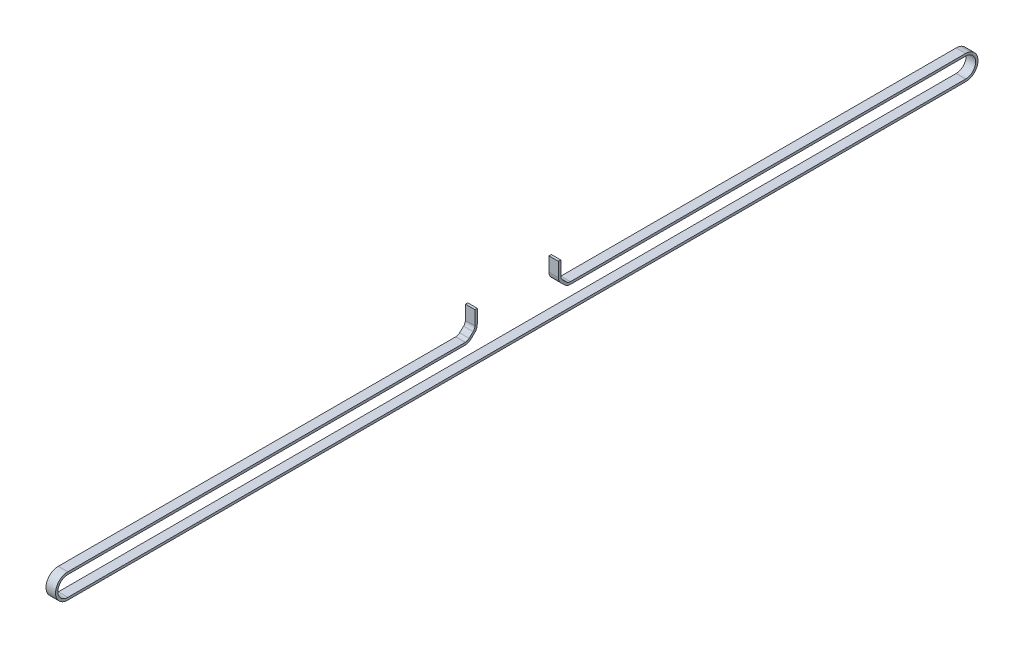
ISO-10303-21;
HEADER;
FILE_DESCRIPTION(('STEP AP214'),'2;1');
FILE_NAME('part.step','',(''),(''),'','','');
FILE_SCHEMA(('AUTOMOTIVE_DESIGN { 1 0 10303 214 1 1 1 1 }'));
ENDSEC;
DATA;
#1=APPLICATION_CONTEXT('core data for automotive mechanical design processes');
#2=APPLICATION_PROTOCOL_DEFINITION('international standard','automotive_design',2000,#1);
#3=PRODUCT_CONTEXT('',#1,'mechanical');
#4=PRODUCT('Part','Part','',(#3));
#5=PRODUCT_RELATED_PRODUCT_CATEGORY('part','',(#4));
#6=PRODUCT_DEFINITION_FORMATION('','',#4);
#7=PRODUCT_DEFINITION_CONTEXT('part definition',#1,'design');
#8=PRODUCT_DEFINITION('design','',#6,#7);
#9=PRODUCT_DEFINITION_SHAPE('','',#8);
#10=(LENGTH_UNIT() NAMED_UNIT(*) SI_UNIT(.MILLI.,.METRE.));
#11=(NAMED_UNIT(*) PLANE_ANGLE_UNIT() SI_UNIT($,.RADIAN.));
#12=(NAMED_UNIT(*) SI_UNIT($,.STERADIAN.) SOLID_ANGLE_UNIT());
#13=UNCERTAINTY_MEASURE_WITH_UNIT(LENGTH_MEASURE(1.E-05),#10,'distance_accuracy_value','');
#14=(GEOMETRIC_REPRESENTATION_CONTEXT(3) GLOBAL_UNCERTAINTY_ASSIGNED_CONTEXT((#13)) GLOBAL_UNIT_ASSIGNED_CONTEXT((#10,
#11,#12)) REPRESENTATION_CONTEXT('',''));
#15=CARTESIAN_POINT('',(0.,0.,0.));
#16=DIRECTION('',(0.,0.,1.));
#17=DIRECTION('',(1.,0.,0.));
#18=AXIS2_PLACEMENT_3D('',#15,#16,#17);
#19=CARTESIAN_POINT('',(3.,6.20000000000011,281.89));
#20=DIRECTION('',(0.,-1.,0.));
#21=DIRECTION('',(0.,0.,-1.));
#22=AXIS2_PLACEMENT_3D('',#19,#20,#21);
#23=PLANE('',#22);
#24=DIRECTION('',(0.,0.,1.));
#25=VECTOR('',#24,1.);
#26=CARTESIAN_POINT('',(-3.,6.20000000000011,281.89));
#27=LINE('',#26,#25);
#28=CARTESIAN_POINT('',(-3.,6.20000000000015,32.3225358476236));
#29=VERTEX_POINT('',#28);
#30=CARTESIAN_POINT('',(-3.,6.20000000000011,281.89));
#31=VERTEX_POINT('',#30);
#32=EDGE_CURVE('E318',#29,#31,#27,.T.);
#33=ORIENTED_EDGE('',*,*,#32,.F.);
#34=DIRECTION('',(1.,0.,0.));
#35=VECTOR('',#34,1.);
#36=CARTESIAN_POINT('',(3.,6.20000000000015,32.3225358476236));
#37=LINE('',#36,#35);
#38=CARTESIAN_POINT('',(3.,6.20000000000015,32.3225358476236));
#39=VERTEX_POINT('',#38);
#40=EDGE_CURVE('E364',#29,#39,#37,.T.);
#41=ORIENTED_EDGE('',*,*,#40,.T.);
#42=DIRECTION('',(0.,0.,1.));
#43=VECTOR('',#42,1.);
#44=CARTESIAN_POINT('',(3.,6.20000000000011,281.89));
#45=LINE('',#44,#43);
#46=CARTESIAN_POINT('',(3.,6.20000000000011,281.89));
#47=VERTEX_POINT('',#46);
#48=EDGE_CURVE('E305',#39,#47,#45,.T.);
#49=ORIENTED_EDGE('',*,*,#48,.T.);
#50=DIRECTION('',(-1.,0.,0.));
#51=VECTOR('',#50,1.);
#52=CARTESIAN_POINT('',(3.,6.20000000000011,281.89));
#53=LINE('',#52,#51);
#54=EDGE_CURVE('E309',#47,#31,#53,.T.);
#55=ORIENTED_EDGE('',*,*,#54,.T.);
#56=EDGE_LOOP('',(#33,#41,#49,#55));
#57=FACE_BOUND('',#56,.T.);
#58=ADVANCED_FACE('F32',(#57),#23,.T.);
#59=CARTESIAN_POINT('',(3.,7.70000000000011,281.89));
#60=DIRECTION('',(0.,-1.,0.));
#61=DIRECTION('',(0.,0.,-1.));
#62=AXIS2_PLACEMENT_3D('',#59,#60,#61);
#63=PLANE('',#62);
#64=DIRECTION('',(0.,0.,1.));
#65=VECTOR('',#64,1.);
#66=CARTESIAN_POINT('',(3.,7.70000000000011,281.89));
#67=LINE('',#66,#65);
#68=CARTESIAN_POINT('',(3.,7.70000000000011,32.3225358476236));
#69=VERTEX_POINT('',#68);
#70=CARTESIAN_POINT('',(3.,7.70000000000011,281.89));
#71=VERTEX_POINT('',#70);
#72=EDGE_CURVE('E339',#69,#71,#67,.T.);
#73=ORIENTED_EDGE('',*,*,#72,.F.);
#74=DIRECTION('',(1.,0.,0.));
#75=VECTOR('',#74,1.);
#76=CARTESIAN_POINT('',(-3.,7.70000000000011,32.3225358476236));
#77=LINE('',#76,#75);
#78=CARTESIAN_POINT('',(-3.,7.70000000000011,32.3225358476236));
#79=VERTEX_POINT('',#78);
#80=EDGE_CURVE('E404',#69,#79,#77,.F.);
#81=ORIENTED_EDGE('',*,*,#80,.T.);
#82=DIRECTION('',(0.,0.,1.));
#83=VECTOR('',#82,1.);
#84=CARTESIAN_POINT('',(-3.,7.70000000000011,281.89));
#85=LINE('',#84,#83);
#86=CARTESIAN_POINT('',(-3.,7.70000000000011,281.89));
#87=VERTEX_POINT('',#86);
#88=EDGE_CURVE('E350',#79,#87,#85,.T.);
#89=ORIENTED_EDGE('',*,*,#88,.T.);
#90=DIRECTION('',(-1.,0.,0.));
#91=VECTOR('',#90,1.);
#92=CARTESIAN_POINT('',(3.,7.70000000000011,281.89));
#93=LINE('',#92,#91);
#94=EDGE_CURVE('E343',#71,#87,#93,.T.);
#95=ORIENTED_EDGE('',*,*,#94,.F.);
#96=EDGE_LOOP('',(#73,#81,#89,#95));
#97=FACE_BOUND('',#96,.T.);
#98=ADVANCED_FACE('F514',(#97),#63,.F.);
#99=CARTESIAN_POINT('',(-3.,7.70000000000011,-281.89));
#100=VERTEX_POINT('',#99);
#101=CARTESIAN_POINT('',(-3.,7.70000000000011,-33.6917996579474));
#102=VERTEX_POINT('',#101);
#103=EDGE_CURVE('E335',#100,#102,#85,.T.);
#104=ORIENTED_EDGE('',*,*,#103,.T.);
#105=DIRECTION('',(-1.,0.,0.));
#106=VECTOR('',#105,1.);
#107=CARTESIAN_POINT('',(3.,7.70000000000011,-33.6917996579474));
#108=LINE('',#107,#106);
#109=CARTESIAN_POINT('',(3.,7.70000000000011,-33.6917996579474));
#110=VERTEX_POINT('',#109);
#111=EDGE_CURVE('E413',#102,#110,#108,.F.);
#112=ORIENTED_EDGE('',*,*,#111,.T.);
#113=CARTESIAN_POINT('',(3.,7.70000000000011,-281.89));
#114=VERTEX_POINT('',#113);
#115=EDGE_CURVE('E340',#114,#110,#67,.T.);
#116=ORIENTED_EDGE('',*,*,#115,.F.);
#117=DIRECTION('',(-1.,0.,0.));
#118=VECTOR('',#117,1.);
#119=CARTESIAN_POINT('',(3.,7.70000000000011,-281.89));
#120=LINE('',#119,#118);
#121=EDGE_CURVE('E355',#114,#100,#120,.T.);
#122=ORIENTED_EDGE('',*,*,#121,.T.);
#123=EDGE_LOOP('',(#104,#112,#116,#122));
#124=FACE_BOUND('',#123,.T.);
#125=ADVANCED_FACE('F530',(#124),#63,.F.);
#126=CARTESIAN_POINT('',(3.,0.,281.89));
#127=DIRECTION('',(1.,0.,0.));
#128=DIRECTION('',(0.,0.,-1.));
#129=AXIS2_PLACEMENT_3D('',#126,#127,#128);
#130=PLANE('',#129);
#131=ORIENTED_EDGE('',*,*,#48,.F.);
#132=CARTESIAN_POINT('',(3.,11.2000000000002,32.3225358476236));
#133=DIRECTION('',(1.,0.,0.));
#134=DIRECTION('',(0.,0.,-1.));
#135=AXIS2_PLACEMENT_3D('',#132,#133,#134);
#136=CIRCLE('',#135,5.);
#137=CARTESIAN_POINT('',(3.,7.58784006199051,28.8653259057429));
#138=VERTEX_POINT('',#137);
#139=EDGE_CURVE('E372',#39,#138,#136,.T.);
#140=ORIENTED_EDGE('',*,*,#139,.T.);
#141=DIRECTION('',(0.,0.691441988376126,-0.722431987601926));
#142=VECTOR('',#141,1.);
#143=CARTESIAN_POINT('',(3.,11.464067761856,24.8153680948381));
#144=LINE('',#143,#142);
#145=CARTESIAN_POINT('',(3.,9.98745841490002,26.3581581529575));
#146=VERTEX_POINT('',#145);
#147=EDGE_CURVE('E228',#138,#146,#144,.T.);
#148=ORIENTED_EDGE('',*,*,#147,.T.);
#149=CARTESIAN_POINT('',(3.,13.5996183529097,29.8153680948381));
#150=DIRECTION('',(1.,0.,0.));
#151=DIRECTION('',(0.,0.,-1.));
#152=AXIS2_PLACEMENT_3D('',#149,#150,#151);
#153=CIRCLE('',#152,5.);
#154=CARTESIAN_POINT('',(3.,13.5996183529097,24.8153680948381));
#155=VERTEX_POINT('',#154);
#156=EDGE_CURVE('E224',#146,#155,#153,.T.);
#157=ORIENTED_EDGE('',*,*,#156,.T.);
#158=DIRECTION('',(0.,1.,0.));
#159=VECTOR('',#158,1.);
#160=CARTESIAN_POINT('',(3.,11.464067761856,24.8153680948381));
#161=LINE('',#160,#159);
#162=CARTESIAN_POINT('',(3.,22.464067761856,24.8153680948381));
#163=VERTEX_POINT('',#162);
#164=EDGE_CURVE('E214',#155,#163,#161,.T.);
#165=ORIENTED_EDGE('',*,*,#164,.T.);
#166=DIRECTION('',(0.,0.,1.));
#167=VECTOR('',#166,1.);
#168=CARTESIAN_POINT('',(3.,22.464067761856,26.3153680948381));
#169=LINE('',#168,#167);
#170=CARTESIAN_POINT('',(3.,22.464067761856,26.3153680948381));
#171=VERTEX_POINT('',#170);
#172=EDGE_CURVE('E220',#163,#171,#169,.T.);
#173=ORIENTED_EDGE('',*,*,#172,.T.);
#174=DIRECTION('',(0.,-1.,0.));
#175=VECTOR('',#174,1.);
#176=CARTESIAN_POINT('',(3.,14.464067761856,26.3153680948381));
#177=LINE('',#176,#175);
#178=CARTESIAN_POINT('',(3.,13.5996183529097,26.3153680948381));
#179=VERTEX_POINT('',#178);
#180=EDGE_CURVE('E244',#171,#179,#177,.T.);
#181=ORIENTED_EDGE('',*,*,#180,.T.);
#182=CARTESIAN_POINT('',(3.,13.5996183529097,29.8153680948381));
#183=DIRECTION('',(1.,0.,0.));
#184=DIRECTION('',(0.,0.,-1.));
#185=AXIS2_PLACEMENT_3D('',#182,#183,#184);
#186=CIRCLE('',#185,3.5);
#187=CARTESIAN_POINT('',(3.,11.0711063963029,27.3953211355216));
#188=VERTEX_POINT('',#187);
#189=EDGE_CURVE('E423',#179,#188,#186,.F.);
#190=ORIENTED_EDGE('',*,*,#189,.T.);
#191=DIRECTION('',(0.,-0.691441988376125,0.722431987601927));
#192=VECTOR('',#191,1.);
#193=CARTESIAN_POINT('',(3.,12.1047329391721,26.3153680948381));
#194=LINE('',#193,#192);
#195=CARTESIAN_POINT('',(3.,8.67148804339336,29.9024888883072));
#196=VERTEX_POINT('',#195);
#197=EDGE_CURVE('E246',#188,#196,#194,.T.);
#198=ORIENTED_EDGE('',*,*,#197,.T.);
#199=CARTESIAN_POINT('',(3.,11.2000000000001,32.3225358476236));
#200=DIRECTION('',(1.,0.,0.));
#201=DIRECTION('',(0.,0.,-1.));
#202=AXIS2_PLACEMENT_3D('',#199,#200,#201);
#203=CIRCLE('',#202,3.5);
#204=EDGE_CURVE('E417',#196,#69,#203,.F.);
#205=ORIENTED_EDGE('',*,*,#204,.T.);
#206=ORIENTED_EDGE('',*,*,#72,.T.);
#207=CARTESIAN_POINT('',(3.,0.,281.89));
#208=DIRECTION('',(1.,0.,0.));
#209=DIRECTION('',(0.,0.,-1.));
#210=AXIS2_PLACEMENT_3D('',#207,#208,#209);
#211=CIRCLE('',#210,7.7000000000001);
#212=CARTESIAN_POINT('',(3.,-7.70000000000011,281.89));
#213=VERTEX_POINT('',#212);
#214=EDGE_CURVE('E331',#71,#213,#211,.T.);
#215=ORIENTED_EDGE('',*,*,#214,.T.);
#216=DIRECTION('',(0.,0.,-1.));
#217=VECTOR('',#216,1.);
#218=CARTESIAN_POINT('',(3.,-7.70000000000011,281.89));
#219=LINE('',#218,#217);
#220=CARTESIAN_POINT('',(3.,-7.6999999999999,-281.89));
#221=VERTEX_POINT('',#220);
#222=EDGE_CURVE('E334',#213,#221,#219,.T.);
#223=ORIENTED_EDGE('',*,*,#222,.T.);
#224=CARTESIAN_POINT('',(3.,0.,-281.89));
#225=DIRECTION('',(1.,0.,0.));
#226=DIRECTION('',(0.,0.,-1.));
#227=AXIS2_PLACEMENT_3D('',#224,#225,#226);
#228=CIRCLE('',#227,7.7);
#229=EDGE_CURVE('E337',#221,#114,#228,.T.);
#230=ORIENTED_EDGE('',*,*,#229,.T.);
#231=ORIENTED_EDGE('',*,*,#115,.T.);
#232=CARTESIAN_POINT('',(3.,11.2000000000001,-33.6917996579474));
#233=DIRECTION('',(1.,0.,0.));
#234=DIRECTION('',(0.,0.,-1.));
#235=AXIS2_PLACEMENT_3D('',#232,#233,#234);
#236=CIRCLE('',#235,3.5);
#237=CARTESIAN_POINT('',(3.,8.67148804339336,-31.271752698631));
#238=VERTEX_POINT('',#237);
#239=EDGE_CURVE('E427',#110,#238,#236,.F.);
#240=ORIENTED_EDGE('',*,*,#239,.T.);
#241=DIRECTION('',(0.,0.691441988376127,0.722431987601925));
#242=VECTOR('',#241,1.);
#243=CARTESIAN_POINT('',(3.,12.1047329391721,-27.6846319051619));
#244=LINE('',#243,#242);
#245=CARTESIAN_POINT('',(3.,11.0711063963029,-28.7645849458455));
#246=VERTEX_POINT('',#245);
#247=EDGE_CURVE('E272',#238,#246,#244,.T.);
#248=ORIENTED_EDGE('',*,*,#247,.T.);
#249=CARTESIAN_POINT('',(3.,13.5996183529097,-31.1846319051619));
#250=DIRECTION('',(1.,0.,0.));
#251=DIRECTION('',(0.,0.,-1.));
#252=AXIS2_PLACEMENT_3D('',#249,#250,#251);
#253=CIRCLE('',#252,3.5);
#254=CARTESIAN_POINT('',(3.,13.5996183529097,-27.6846319051619));
#255=VERTEX_POINT('',#254);
#256=EDGE_CURVE('E11',#246,#255,#253,.F.);
#257=ORIENTED_EDGE('',*,*,#256,.T.);
#258=DIRECTION('',(0.,1.,0.));
#259=VECTOR('',#258,1.);
#260=CARTESIAN_POINT('',(3.,14.464067761856,-27.6846319051619));
#261=LINE('',#260,#259);
#262=CARTESIAN_POINT('',(3.,22.464067761856,-27.6846319051619));
#263=VERTEX_POINT('',#262);
#264=EDGE_CURVE('E274',#255,#263,#261,.T.);
#265=ORIENTED_EDGE('',*,*,#264,.T.);
#266=DIRECTION('',(0.,0.,1.));
#267=VECTOR('',#266,1.);
#268=CARTESIAN_POINT('',(3.,22.464067761856,-27.6846319051619));
#269=LINE('',#268,#267);
#270=CARTESIAN_POINT('',(3.,22.464067761856,-26.1846319051619));
#271=VERTEX_POINT('',#270);
#272=EDGE_CURVE('E276',#263,#271,#269,.T.);
#273=ORIENTED_EDGE('',*,*,#272,.T.);
#274=DIRECTION('',(0.,-1.,0.));
#275=VECTOR('',#274,1.);
#276=CARTESIAN_POINT('',(3.,22.464067761856,-26.1846319051619));
#277=LINE('',#276,#275);
#278=CARTESIAN_POINT('',(3.,13.5996183529097,-26.1846319051619));
#279=VERTEX_POINT('',#278);
#280=EDGE_CURVE('E265',#271,#279,#277,.T.);
#281=ORIENTED_EDGE('',*,*,#280,.T.);
#282=CARTESIAN_POINT('',(3.,13.5996183529097,-31.1846319051619));
#283=DIRECTION('',(1.,0.,0.));
#284=DIRECTION('',(0.,0.,-1.));
#285=AXIS2_PLACEMENT_3D('',#282,#283,#284);
#286=CIRCLE('',#285,5.);
#287=CARTESIAN_POINT('',(3.,9.98745841490002,-27.7274219632813));
#288=VERTEX_POINT('',#287);
#289=EDGE_CURVE('E369',#279,#288,#286,.T.);
#290=ORIENTED_EDGE('',*,*,#289,.T.);
#291=DIRECTION('',(0.,-0.691441988376127,-0.722431987601925));
#292=VECTOR('',#291,1.);
#293=CARTESIAN_POINT('',(3.,11.464067761856,-26.1846319051619));
#294=LINE('',#293,#292);
#295=CARTESIAN_POINT('',(3.,7.58784006199054,-30.2345897160667));
#296=VERTEX_POINT('',#295);
#297=EDGE_CURVE('E268',#288,#296,#294,.T.);
#298=ORIENTED_EDGE('',*,*,#297,.T.);
#299=CARTESIAN_POINT('',(3.,11.2000000000002,-33.6917996579473));
#300=DIRECTION('',(1.,0.,0.));
#301=DIRECTION('',(0.,0.,-1.));
#302=AXIS2_PLACEMENT_3D('',#299,#300,#301);
#303=CIRCLE('',#302,5.);
#304=CARTESIAN_POINT('',(3.,6.20000000000016,-33.6917996579473));
#305=VERTEX_POINT('',#304);
#306=EDGE_CURVE('E367',#296,#305,#303,.T.);
#307=ORIENTED_EDGE('',*,*,#306,.T.);
#308=CARTESIAN_POINT('',(3.,6.20000000000021,-281.89));
#309=VERTEX_POINT('',#308);
#310=EDGE_CURVE('E306',#309,#305,#45,.T.);
#311=ORIENTED_EDGE('',*,*,#310,.F.);
#312=CARTESIAN_POINT('',(3.,0.,-281.89));
#313=DIRECTION('',(1.,0.,0.));
#314=DIRECTION('',(0.,0.,-1.));
#315=AXIS2_PLACEMENT_3D('',#312,#313,#314);
#316=CIRCLE('',#315,6.2000000000001);
#317=CARTESIAN_POINT('',(3.,-6.2,-281.89));
#318=VERTEX_POINT('',#317);
#319=EDGE_CURVE('E302',#318,#309,#316,.T.);
#320=ORIENTED_EDGE('',*,*,#319,.F.);
#321=DIRECTION('',(0.,0.,-1.));
#322=VECTOR('',#321,1.);
#323=CARTESIAN_POINT('',(3.,-6.20000000000011,281.89));
#324=LINE('',#323,#322);
#325=CARTESIAN_POINT('',(3.,-6.20000000000011,281.89));
#326=VERTEX_POINT('',#325);
#327=EDGE_CURVE('E299',#326,#318,#324,.T.);
#328=ORIENTED_EDGE('',*,*,#327,.F.);
#329=CARTESIAN_POINT('',(3.,0.,281.89));
#330=DIRECTION('',(1.,0.,0.));
#331=DIRECTION('',(0.,0.,-1.));
#332=AXIS2_PLACEMENT_3D('',#329,#330,#331);
#333=CIRCLE('',#332,6.2000000000001);
#334=EDGE_CURVE('E297',#47,#326,#333,.T.);
#335=ORIENTED_EDGE('',*,*,#334,.F.);
#336=EDGE_LOOP('',(#131,#140,#148,#157,#165,#173,#181,#190,#198,#205,#206,#215,#223,#230,#231,
#240,#248,#257,#265,#273,#281,#290,#298,#307,#311,#320,#328,#335));
#337=FACE_BOUND('',#336,.T.);
#338=ADVANCED_FACE('F217',(#337),#130,.T.);
#339=CARTESIAN_POINT('',(-3.,0.,281.89));
#340=DIRECTION('',(1.,0.,0.));
#341=DIRECTION('',(0.,0.,-1.));
#342=AXIS2_PLACEMENT_3D('',#339,#340,#341);
#343=PLANE('',#342);
#344=DIRECTION('',(0.,0.691441988376126,-0.722431987601926));
#345=VECTOR('',#344,1.);
#346=CARTESIAN_POINT('',(-3.,11.464067761856,24.8153680948381));
#347=LINE('',#346,#345);
#348=CARTESIAN_POINT('',(-3.,7.58784006199051,28.8653259057429));
#349=VERTEX_POINT('',#348);
#350=CARTESIAN_POINT('',(-3.,9.98745841490002,26.3581581529575));
#351=VERTEX_POINT('',#350);
#352=EDGE_CURVE('E252',#349,#351,#347,.T.);
#353=ORIENTED_EDGE('',*,*,#352,.F.);
#354=CARTESIAN_POINT('',(-3.,11.2000000000002,32.3225358476236));
#355=DIRECTION('',(1.,0.,0.));
#356=DIRECTION('',(0.,0.,-1.));
#357=AXIS2_PLACEMENT_3D('',#354,#355,#356);
#358=CIRCLE('',#357,5.);
#359=EDGE_CURVE('E384',#349,#29,#358,.F.);
#360=ORIENTED_EDGE('',*,*,#359,.T.);
#361=ORIENTED_EDGE('',*,*,#32,.T.);
#362=CARTESIAN_POINT('',(-3.,0.,281.89));
#363=DIRECTION('',(1.,0.,0.));
#364=DIRECTION('',(0.,0.,-1.));
#365=AXIS2_PLACEMENT_3D('',#362,#363,#364);
#366=CIRCLE('',#365,6.2000000000001);
#367=CARTESIAN_POINT('',(-3.,-6.20000000000011,281.89));
#368=VERTEX_POINT('',#367);
#369=EDGE_CURVE('E296',#31,#368,#366,.T.);
#370=ORIENTED_EDGE('',*,*,#369,.T.);
#371=DIRECTION('',(0.,0.,-1.));
#372=VECTOR('',#371,1.);
#373=CARTESIAN_POINT('',(-3.,-6.20000000000011,281.89));
#374=LINE('',#373,#372);
#375=CARTESIAN_POINT('',(-3.,-6.2,-281.89));
#376=VERTEX_POINT('',#375);
#377=EDGE_CURVE('E312',#368,#376,#374,.T.);
#378=ORIENTED_EDGE('',*,*,#377,.T.);
#379=CARTESIAN_POINT('',(-3.,0.,-281.89));
#380=DIRECTION('',(1.,0.,0.));
#381=DIRECTION('',(0.,0.,-1.));
#382=AXIS2_PLACEMENT_3D('',#379,#380,#381);
#383=CIRCLE('',#382,6.2000000000001);
#384=CARTESIAN_POINT('',(-3.,6.20000000000021,-281.89));
#385=VERTEX_POINT('',#384);
#386=EDGE_CURVE('E315',#376,#385,#383,.T.);
#387=ORIENTED_EDGE('',*,*,#386,.T.);
#388=CARTESIAN_POINT('',(-3.,6.20000000000016,-33.6917996579473));
#389=VERTEX_POINT('',#388);
#390=EDGE_CURVE('E300',#385,#389,#27,.T.);
#391=ORIENTED_EDGE('',*,*,#390,.T.);
#392=CARTESIAN_POINT('',(-3.,11.2000000000002,-33.6917996579473));
#393=DIRECTION('',(1.,0.,0.));
#394=DIRECTION('',(0.,0.,-1.));
#395=AXIS2_PLACEMENT_3D('',#392,#393,#394);
#396=CIRCLE('',#395,5.);
#397=CARTESIAN_POINT('',(-3.,7.58784006199054,-30.2345897160667));
#398=VERTEX_POINT('',#397);
#399=EDGE_CURVE('E378',#389,#398,#396,.F.);
#400=ORIENTED_EDGE('',*,*,#399,.T.);
#401=DIRECTION('',(0.,-0.691441988376127,-0.722431987601925));
#402=VECTOR('',#401,1.);
#403=CARTESIAN_POINT('',(-3.,11.464067761856,-26.1846319051619));
#404=LINE('',#403,#402);
#405=CARTESIAN_POINT('',(-3.,9.98745841490002,-27.7274219632813));
#406=VERTEX_POINT('',#405);
#407=EDGE_CURVE('E281',#406,#398,#404,.T.);
#408=ORIENTED_EDGE('',*,*,#407,.F.);
#409=CARTESIAN_POINT('',(-3.,13.5996183529097,-31.1846319051619));
#410=DIRECTION('',(1.,0.,0.));
#411=DIRECTION('',(0.,0.,-1.));
#412=AXIS2_PLACEMENT_3D('',#409,#410,#411);
#413=CIRCLE('',#412,5.);
#414=CARTESIAN_POINT('',(-3.,13.5996183529097,-26.1846319051619));
#415=VERTEX_POINT('',#414);
#416=EDGE_CURVE('E380',#406,#415,#413,.F.);
#417=ORIENTED_EDGE('',*,*,#416,.T.);
#418=DIRECTION('',(0.,-1.,0.));
#419=VECTOR('',#418,1.);
#420=CARTESIAN_POINT('',(-3.,14.464067761856,-26.1846319051619));
#421=LINE('',#420,#419);
#422=CARTESIAN_POINT('',(-3.,22.464067761856,-26.1846319051619));
#423=VERTEX_POINT('',#422);
#424=EDGE_CURVE('E238',#423,#415,#421,.T.);
#425=ORIENTED_EDGE('',*,*,#424,.F.);
#426=DIRECTION('',(0.,0.,1.));
#427=VECTOR('',#426,1.);
#428=CARTESIAN_POINT('',(-3.,22.464067761856,-27.6846319051619));
#429=LINE('',#428,#427);
#430=CARTESIAN_POINT('',(-3.,22.464067761856,-27.6846319051619));
#431=VERTEX_POINT('',#430);
#432=EDGE_CURVE('E269',#431,#423,#429,.T.);
#433=ORIENTED_EDGE('',*,*,#432,.F.);
#434=DIRECTION('',(0.,1.,0.));
#435=VECTOR('',#434,1.);
#436=CARTESIAN_POINT('',(-3.,14.464067761856,-27.6846319051619));
#437=LINE('',#436,#435);
#438=CARTESIAN_POINT('',(-3.,13.5996183529097,-27.6846319051619));
#439=VERTEX_POINT('',#438);
#440=EDGE_CURVE('E287',#439,#431,#437,.T.);
#441=ORIENTED_EDGE('',*,*,#440,.F.);
#442=CARTESIAN_POINT('',(-3.,13.5996183529097,-31.1846319051619));
#443=DIRECTION('',(1.,0.,0.));
#444=DIRECTION('',(0.,0.,-1.));
#445=AXIS2_PLACEMENT_3D('',#442,#443,#444);
#446=CIRCLE('',#445,3.5);
#447=CARTESIAN_POINT('',(-3.,11.0711063963029,-28.7645849458455));
#448=VERTEX_POINT('',#447);
#449=EDGE_CURVE('E40',#439,#448,#446,.T.);
#450=ORIENTED_EDGE('',*,*,#449,.T.);
#451=DIRECTION('',(0.,0.691441988376127,0.722431987601925));
#452=VECTOR('',#451,1.);
#453=CARTESIAN_POINT('',(-3.,12.1047329391721,-27.6846319051619));
#454=LINE('',#453,#452);
#455=CARTESIAN_POINT('',(-3.,8.67148804339336,-31.271752698631));
#456=VERTEX_POINT('',#455);
#457=EDGE_CURVE('E284',#456,#448,#454,.T.);
#458=ORIENTED_EDGE('',*,*,#457,.F.);
#459=CARTESIAN_POINT('',(-3.,11.2000000000001,-33.6917996579474));
#460=DIRECTION('',(1.,0.,0.));
#461=DIRECTION('',(0.,0.,-1.));
#462=AXIS2_PLACEMENT_3D('',#459,#460,#461);
#463=CIRCLE('',#462,3.5);
#464=EDGE_CURVE('E425',#456,#102,#463,.T.);
#465=ORIENTED_EDGE('',*,*,#464,.T.);
#466=ORIENTED_EDGE('',*,*,#103,.F.);
#467=CARTESIAN_POINT('',(-3.,0.,-281.89));
#468=DIRECTION('',(1.,0.,0.));
#469=DIRECTION('',(0.,0.,-1.));
#470=AXIS2_PLACEMENT_3D('',#467,#468,#469);
#471=CIRCLE('',#470,7.7);
#472=CARTESIAN_POINT('',(-3.,-7.6999999999999,-281.89));
#473=VERTEX_POINT('',#472);
#474=EDGE_CURVE('E348',#473,#100,#471,.T.);
#475=ORIENTED_EDGE('',*,*,#474,.F.);
#476=DIRECTION('',(0.,0.,-1.));
#477=VECTOR('',#476,1.);
#478=CARTESIAN_POINT('',(-3.,-7.70000000000011,281.89));
#479=LINE('',#478,#477);
#480=CARTESIAN_POINT('',(-3.,-7.70000000000011,281.89));
#481=VERTEX_POINT('',#480);
#482=EDGE_CURVE('E346',#481,#473,#479,.T.);
#483=ORIENTED_EDGE('',*,*,#482,.F.);
#484=CARTESIAN_POINT('',(-3.,0.,281.89));
#485=DIRECTION('',(1.,0.,0.));
#486=DIRECTION('',(0.,0.,-1.));
#487=AXIS2_PLACEMENT_3D('',#484,#485,#486);
#488=CIRCLE('',#487,7.7000000000001);
#489=EDGE_CURVE('E330',#87,#481,#488,.T.);
#490=ORIENTED_EDGE('',*,*,#489,.F.);
#491=ORIENTED_EDGE('',*,*,#88,.F.);
#492=CARTESIAN_POINT('',(-3.,11.2000000000001,32.3225358476236));
#493=DIRECTION('',(1.,0.,0.));
#494=DIRECTION('',(0.,0.,-1.));
#495=AXIS2_PLACEMENT_3D('',#492,#493,#494);
#496=CIRCLE('',#495,3.5);
#497=CARTESIAN_POINT('',(-3.,8.67148804339336,29.9024888883072));
#498=VERTEX_POINT('',#497);
#499=EDGE_CURVE('E419',#79,#498,#496,.T.);
#500=ORIENTED_EDGE('',*,*,#499,.T.);
#501=DIRECTION('',(0.,-0.691441988376125,0.722431987601927));
#502=VECTOR('',#501,1.);
#503=CARTESIAN_POINT('',(-3.,12.1047329391721,26.3153680948381));
#504=LINE('',#503,#502);
#505=CARTESIAN_POINT('',(-3.,11.0711063963029,27.3953211355216));
#506=VERTEX_POINT('',#505);
#507=EDGE_CURVE('E261',#506,#498,#504,.T.);
#508=ORIENTED_EDGE('',*,*,#507,.F.);
#509=CARTESIAN_POINT('',(-3.,13.5996183529097,29.8153680948381));
#510=DIRECTION('',(1.,0.,0.));
#511=DIRECTION('',(0.,0.,-1.));
#512=AXIS2_PLACEMENT_3D('',#509,#510,#511);
#513=CIRCLE('',#512,3.5);
#514=CARTESIAN_POINT('',(-3.,13.5996183529097,26.3153680948381));
#515=VERTEX_POINT('',#514);
#516=EDGE_CURVE('E421',#506,#515,#513,.T.);
#517=ORIENTED_EDGE('',*,*,#516,.T.);
#518=DIRECTION('',(0.,-1.,0.));
#519=VECTOR('',#518,1.);
#520=CARTESIAN_POINT('',(-3.,14.464067761856,26.3153680948381));
#521=LINE('',#520,#519);
#522=CARTESIAN_POINT('',(-3.,22.464067761856,26.3153680948381));
#523=VERTEX_POINT('',#522);
#524=EDGE_CURVE('E258',#523,#515,#521,.T.);
#525=ORIENTED_EDGE('',*,*,#524,.F.);
#526=DIRECTION('',(0.,0.,1.));
#527=VECTOR('',#526,1.);
#528=CARTESIAN_POINT('',(-3.,22.464067761856,26.3153680948381));
#529=LINE('',#528,#527);
#530=CARTESIAN_POINT('',(-3.,22.464067761856,24.8153680948381));
#531=VERTEX_POINT('',#530);
#532=EDGE_CURVE('E256',#531,#523,#529,.T.);
#533=ORIENTED_EDGE('',*,*,#532,.F.);
#534=DIRECTION('',(0.,1.,0.));
#535=VECTOR('',#534,1.);
#536=CARTESIAN_POINT('',(-3.,22.464067761856,24.8153680948381));
#537=LINE('',#536,#535);
#538=CARTESIAN_POINT('',(-3.,13.5996183529097,24.8153680948381));
#539=VERTEX_POINT('',#538);
#540=EDGE_CURVE('E234',#539,#531,#537,.T.);
#541=ORIENTED_EDGE('',*,*,#540,.F.);
#542=CARTESIAN_POINT('',(-3.,13.5996183529097,29.8153680948381));
#543=DIRECTION('',(1.,0.,0.));
#544=DIRECTION('',(0.,0.,-1.));
#545=AXIS2_PLACEMENT_3D('',#542,#543,#544);
#546=CIRCLE('',#545,5.);
#547=EDGE_CURVE('E382',#539,#351,#546,.F.);
#548=ORIENTED_EDGE('',*,*,#547,.T.);
#549=EDGE_LOOP('',(#353,#360,#361,#370,#378,#387,#391,#400,#408,#417,#425,#433,#441,#450,#458,
#465,#466,#475,#483,#490,#491,#500,#508,#517,#525,#533,#541,#548));
#550=FACE_BOUND('',#549,.T.);
#551=ADVANCED_FACE('F432',(#550),#343,.F.);
#552=CARTESIAN_POINT('',(3.,0.,281.89));
#553=DIRECTION('',(-1.,0.,0.));
#554=DIRECTION('',(0.,0.,1.));
#555=AXIS2_PLACEMENT_3D('',#552,#553,#554);
#556=CYLINDRICAL_SURFACE('',#555,7.7000000000001);
#557=ORIENTED_EDGE('',*,*,#489,.T.);
#558=DIRECTION('',(-1.,0.,0.));
#559=VECTOR('',#558,1.);
#560=CARTESIAN_POINT('',(3.,-7.70000000000011,281.89));
#561=LINE('',#560,#559);
#562=EDGE_CURVE('E361',#213,#481,#561,.T.);
#563=ORIENTED_EDGE('',*,*,#562,.F.);
#564=ORIENTED_EDGE('',*,*,#214,.F.);
#565=ORIENTED_EDGE('',*,*,#94,.T.);
#566=EDGE_LOOP('',(#557,#563,#564,#565));
#567=FACE_BOUND('',#566,.T.);
#568=ADVANCED_FACE('F518',(#567),#556,.T.);
#569=CARTESIAN_POINT('',(3.,-7.70000000000011,281.89));
#570=DIRECTION('',(0.,1.,0.));
#571=DIRECTION('',(0.,0.,1.));
#572=AXIS2_PLACEMENT_3D('',#569,#570,#571);
#573=PLANE('',#572);
#574=ORIENTED_EDGE('',*,*,#482,.T.);
#575=DIRECTION('',(-1.,0.,0.));
#576=VECTOR('',#575,1.);
#577=CARTESIAN_POINT('',(3.,-7.6999999999999,-281.89));
#578=LINE('',#577,#576);
#579=EDGE_CURVE('E358',#221,#473,#578,.T.);
#580=ORIENTED_EDGE('',*,*,#579,.F.);
#581=ORIENTED_EDGE('',*,*,#222,.F.);
#582=ORIENTED_EDGE('',*,*,#562,.T.);
#583=EDGE_LOOP('',(#574,#580,#581,#582));
#584=FACE_BOUND('',#583,.T.);
#585=ADVANCED_FACE('F523',(#584),#573,.F.);
#586=CARTESIAN_POINT('',(3.,0.,-281.89));
#587=DIRECTION('',(-1.,0.,0.));
#588=DIRECTION('',(0.,0.,1.));
#589=AXIS2_PLACEMENT_3D('',#586,#587,#588);
#590=CYLINDRICAL_SURFACE('',#589,7.7);
#591=ORIENTED_EDGE('',*,*,#474,.T.);
#592=ORIENTED_EDGE('',*,*,#121,.F.);
#593=ORIENTED_EDGE('',*,*,#229,.F.);
#594=ORIENTED_EDGE('',*,*,#579,.T.);
#595=EDGE_LOOP('',(#591,#592,#593,#594));
#596=FACE_BOUND('',#595,.T.);
#597=ADVANCED_FACE('F526',(#596),#590,.T.);
#598=CARTESIAN_POINT('',(3.,0.,281.89));
#599=DIRECTION('',(-1.,0.,0.));
#600=DIRECTION('',(0.,0.,1.));
#601=AXIS2_PLACEMENT_3D('',#598,#599,#600);
#602=CYLINDRICAL_SURFACE('',#601,6.2000000000001);
#603=ORIENTED_EDGE('',*,*,#369,.F.);
#604=ORIENTED_EDGE('',*,*,#54,.F.);
#605=ORIENTED_EDGE('',*,*,#334,.T.);
#606=DIRECTION('',(-1.,0.,0.));
#607=VECTOR('',#606,1.);
#608=CARTESIAN_POINT('',(3.,-6.20000000000011,281.89));
#609=LINE('',#608,#607);
#610=EDGE_CURVE('E327',#326,#368,#609,.T.);
#611=ORIENTED_EDGE('',*,*,#610,.T.);
#612=EDGE_LOOP('',(#603,#604,#605,#611));
#613=FACE_BOUND('',#612,.T.);
#614=ADVANCED_FACE('F478',(#613),#602,.F.);
#615=CARTESIAN_POINT('',(3.,-6.20000000000011,281.89));
#616=DIRECTION('',(0.,1.,0.));
#617=DIRECTION('',(0.,0.,1.));
#618=AXIS2_PLACEMENT_3D('',#615,#616,#617);
#619=PLANE('',#618);
#620=ORIENTED_EDGE('',*,*,#377,.F.);
#621=ORIENTED_EDGE('',*,*,#610,.F.);
#622=ORIENTED_EDGE('',*,*,#327,.T.);
#623=DIRECTION('',(-1.,0.,0.));
#624=VECTOR('',#623,1.);
#625=CARTESIAN_POINT('',(3.,-6.2,-281.89));
#626=LINE('',#625,#624);
#627=EDGE_CURVE('E325',#318,#376,#626,.T.);
#628=ORIENTED_EDGE('',*,*,#627,.T.);
#629=EDGE_LOOP('',(#620,#621,#622,#628));
#630=FACE_BOUND('',#629,.T.);
#631=ADVANCED_FACE('F475',(#630),#619,.T.);
#632=CARTESIAN_POINT('',(3.,0.,-281.89));
#633=DIRECTION('',(-1.,0.,0.));
#634=DIRECTION('',(0.,0.,1.));
#635=AXIS2_PLACEMENT_3D('',#632,#633,#634);
#636=CYLINDRICAL_SURFACE('',#635,6.2000000000001);
#637=ORIENTED_EDGE('',*,*,#386,.F.);
#638=ORIENTED_EDGE('',*,*,#627,.F.);
#639=ORIENTED_EDGE('',*,*,#319,.T.);
#640=DIRECTION('',(-1.,0.,0.));
#641=VECTOR('',#640,1.);
#642=CARTESIAN_POINT('',(3.,6.20000000000021,-281.89));
#643=LINE('',#642,#641);
#644=EDGE_CURVE('E323',#309,#385,#643,.T.);
#645=ORIENTED_EDGE('',*,*,#644,.T.);
#646=EDGE_LOOP('',(#637,#638,#639,#645));
#647=FACE_BOUND('',#646,.T.);
#648=ADVANCED_FACE('F470',(#647),#636,.F.);
#649=ORIENTED_EDGE('',*,*,#310,.T.);
#650=DIRECTION('',(1.,0.,0.));
#651=VECTOR('',#650,1.);
#652=CARTESIAN_POINT('',(-3.,6.20000000000016,-33.6917996579473));
#653=LINE('',#652,#651);
#654=EDGE_CURVE('E396',#305,#389,#653,.F.);
#655=ORIENTED_EDGE('',*,*,#654,.T.);
#656=ORIENTED_EDGE('',*,*,#390,.F.);
#657=ORIENTED_EDGE('',*,*,#644,.F.);
#658=EDGE_LOOP('',(#649,#655,#656,#657));
#659=FACE_BOUND('',#658,.T.);
#660=ADVANCED_FACE('F465',(#659),#23,.T.);
#661=CARTESIAN_POINT('',(3.,11.464067761856,-26.1846319051619));
#662=DIRECTION('',(0.,0.722431987601925,-0.691441988376127));
#663=DIRECTION('',(0.,0.691441988376127,0.722431987601925));
#664=AXIS2_PLACEMENT_3D('',#661,#662,#663);
#665=PLANE('',#664);
#666=ORIENTED_EDGE('',*,*,#297,.F.);
#667=DIRECTION('',(-1.,0.,0.));
#668=VECTOR('',#667,1.);
#669=CARTESIAN_POINT('',(3.,9.98745841490002,-27.7274219632813));
#670=LINE('',#669,#668);
#671=EDGE_CURVE('E391',#288,#406,#670,.T.);
#672=ORIENTED_EDGE('',*,*,#671,.T.);
#673=ORIENTED_EDGE('',*,*,#407,.T.);
#674=DIRECTION('',(1.,0.,0.));
#675=VECTOR('',#674,1.);
#676=CARTESIAN_POINT('',(3.,7.58784006199054,-30.2345897160667));
#677=LINE('',#676,#675);
#678=EDGE_CURVE('E388',#398,#296,#677,.T.);
#679=ORIENTED_EDGE('',*,*,#678,.T.);
#680=EDGE_LOOP('',(#666,#672,#673,#679));
#681=FACE_BOUND('',#680,.T.);
#682=ADVANCED_FACE('F455',(#681),#665,.F.);
#683=CARTESIAN_POINT('',(3.,12.1047329391721,-27.6846319051619));
#684=DIRECTION('',(0.,-0.722431987601925,0.691441988376127));
#685=DIRECTION('',(0.,-0.691441988376127,-0.722431987601925));
#686=AXIS2_PLACEMENT_3D('',#683,#684,#685);
#687=PLANE('',#686);
#688=ORIENTED_EDGE('',*,*,#247,.F.);
#689=DIRECTION('',(-1.,0.,0.));
#690=VECTOR('',#689,1.);
#691=CARTESIAN_POINT('',(-3.,8.67148804339336,-31.271752698631));
#692=LINE('',#691,#690);
#693=EDGE_CURVE('E410',#238,#456,#692,.T.);
#694=ORIENTED_EDGE('',*,*,#693,.T.);
#695=ORIENTED_EDGE('',*,*,#457,.T.);
#696=DIRECTION('',(-1.,0.,0.));
#697=VECTOR('',#696,1.);
#698=CARTESIAN_POINT('',(3.,11.0711063963029,-28.7645849458455));
#699=LINE('',#698,#697);
#700=EDGE_CURVE('E408',#448,#246,#699,.F.);
#701=ORIENTED_EDGE('',*,*,#700,.T.);
#702=EDGE_LOOP('',(#688,#694,#695,#701));
#703=FACE_BOUND('',#702,.T.);
#704=ADVANCED_FACE('F436',(#703),#687,.F.);
#705=CARTESIAN_POINT('',(3.,14.464067761856,-26.1846319051619));
#706=DIRECTION('',(0.,0.,-1.));
#707=DIRECTION('',(-1.,0.,0.));
#708=AXIS2_PLACEMENT_3D('',#705,#706,#707);
#709=PLANE('',#708);
#710=ORIENTED_EDGE('',*,*,#424,.T.);
#711=DIRECTION('',(-1.,0.,0.));
#712=VECTOR('',#711,1.);
#713=CARTESIAN_POINT('',(3.,13.5996183529097,-26.1846319051619));
#714=LINE('',#713,#712);
#715=EDGE_CURVE('E394',#415,#279,#714,.F.);
#716=ORIENTED_EDGE('',*,*,#715,.T.);
#717=ORIENTED_EDGE('',*,*,#280,.F.);
#718=DIRECTION('',(-1.,0.,0.));
#719=VECTOR('',#718,1.);
#720=CARTESIAN_POINT('',(3.,22.464067761856,-26.1846319051619));
#721=LINE('',#720,#719);
#722=EDGE_CURVE('E278',#271,#423,#721,.T.);
#723=ORIENTED_EDGE('',*,*,#722,.T.);
#724=EDGE_LOOP('',(#710,#716,#717,#723));
#725=FACE_BOUND('',#724,.T.);
#726=ADVANCED_FACE('F448',(#725),#709,.F.);
#727=CARTESIAN_POINT('',(3.,14.464067761856,-27.6846319051619));
#728=DIRECTION('',(0.,0.,1.));
#729=DIRECTION('',(1.,0.,0.));
#730=AXIS2_PLACEMENT_3D('',#727,#728,#729);
#731=PLANE('',#730);
#732=ORIENTED_EDGE('',*,*,#264,.F.);
#733=DIRECTION('',(-1.,0.,0.));
#734=VECTOR('',#733,1.);
#735=CARTESIAN_POINT('',(-3.,13.5996183529097,-27.6846319051619));
#736=LINE('',#735,#734);
#737=EDGE_CURVE('E415',#255,#439,#736,.T.);
#738=ORIENTED_EDGE('',*,*,#737,.T.);
#739=ORIENTED_EDGE('',*,*,#440,.T.);
#740=DIRECTION('',(-1.,0.,0.));
#741=VECTOR('',#740,1.);
#742=CARTESIAN_POINT('',(3.,22.464067761856,-27.6846319051619));
#743=LINE('',#742,#741);
#744=EDGE_CURVE('E293',#263,#431,#743,.T.);
#745=ORIENTED_EDGE('',*,*,#744,.F.);
#746=EDGE_LOOP('',(#732,#738,#739,#745));
#747=FACE_BOUND('',#746,.T.);
#748=ADVANCED_FACE('F439',(#747),#731,.F.);
#749=CARTESIAN_POINT('',(3.,22.464067761856,-27.6846319051619));
#750=DIRECTION('',(0.,-1.,0.));
#751=DIRECTION('',(0.,0.,-1.));
#752=AXIS2_PLACEMENT_3D('',#749,#750,#751);
#753=PLANE('',#752);
#754=ORIENTED_EDGE('',*,*,#432,.T.);
#755=ORIENTED_EDGE('',*,*,#722,.F.);
#756=ORIENTED_EDGE('',*,*,#272,.F.);
#757=ORIENTED_EDGE('',*,*,#744,.T.);
#758=EDGE_LOOP('',(#754,#755,#756,#757));
#759=FACE_BOUND('',#758,.T.);
#760=ADVANCED_FACE('F446',(#759),#753,.F.);
#761=CARTESIAN_POINT('',(3.,11.464067761856,24.8153680948381));
#762=DIRECTION('',(0.,0.722431987601926,0.691441988376126));
#763=DIRECTION('',(0.,-0.691441988376126,0.722431987601926));
#764=AXIS2_PLACEMENT_3D('',#761,#762,#763);
#765=PLANE('',#764);
#766=ORIENTED_EDGE('',*,*,#147,.F.);
#767=DIRECTION('',(1.,0.,0.));
#768=VECTOR('',#767,1.);
#769=CARTESIAN_POINT('',(-3.,7.58784006199051,28.8653259057429));
#770=LINE('',#769,#768);
#771=EDGE_CURVE('E376',#138,#349,#770,.F.);
#772=ORIENTED_EDGE('',*,*,#771,.T.);
#773=ORIENTED_EDGE('',*,*,#352,.T.);
#774=DIRECTION('',(-1.,0.,0.));
#775=VECTOR('',#774,1.);
#776=CARTESIAN_POINT('',(3.,9.98745841490002,26.3581581529575));
#777=LINE('',#776,#775);
#778=EDGE_CURVE('E374',#351,#146,#777,.F.);
#779=ORIENTED_EDGE('',*,*,#778,.T.);
#780=EDGE_LOOP('',(#766,#772,#773,#779));
#781=FACE_BOUND('',#780,.T.);
#782=ADVANCED_FACE('F489',(#781),#765,.F.);
#783=CARTESIAN_POINT('',(3.,12.1047329391721,26.3153680948381));
#784=DIRECTION('',(0.,-0.722431987601927,-0.691441988376125));
#785=DIRECTION('',(0.,0.691441988376125,-0.722431987601927));
#786=AXIS2_PLACEMENT_3D('',#783,#784,#785);
#787=PLANE('',#786);
#788=ORIENTED_EDGE('',*,*,#507,.T.);
#789=DIRECTION('',(1.,0.,0.));
#790=VECTOR('',#789,1.);
#791=CARTESIAN_POINT('',(3.,8.67148804339336,29.9024888883072));
#792=LINE('',#791,#790);
#793=EDGE_CURVE('E401',#498,#196,#792,.T.);
#794=ORIENTED_EDGE('',*,*,#793,.T.);
#795=ORIENTED_EDGE('',*,*,#197,.F.);
#796=DIRECTION('',(-1.,0.,0.));
#797=VECTOR('',#796,1.);
#798=CARTESIAN_POINT('',(-3.,11.0711063963029,27.3953211355216));
#799=LINE('',#798,#797);
#800=EDGE_CURVE('E398',#188,#506,#799,.T.);
#801=ORIENTED_EDGE('',*,*,#800,.T.);
#802=EDGE_LOOP('',(#788,#794,#795,#801));
#803=FACE_BOUND('',#802,.T.);
#804=ADVANCED_FACE('F503',(#803),#787,.F.);
#805=CARTESIAN_POINT('',(3.,22.464067761856,24.8153680948381));
#806=DIRECTION('',(0.,0.,1.));
#807=DIRECTION('',(1.,0.,0.));
#808=AXIS2_PLACEMENT_3D('',#805,#806,#807);
#809=PLANE('',#808);
#810=ORIENTED_EDGE('',*,*,#164,.F.);
#811=DIRECTION('',(-1.,0.,0.));
#812=VECTOR('',#811,1.);
#813=CARTESIAN_POINT('',(3.,13.5996183529097,24.8153680948381));
#814=LINE('',#813,#812);
#815=EDGE_CURVE('E386',#155,#539,#814,.T.);
#816=ORIENTED_EDGE('',*,*,#815,.T.);
#817=ORIENTED_EDGE('',*,*,#540,.T.);
#818=DIRECTION('',(-1.,0.,0.));
#819=VECTOR('',#818,1.);
#820=CARTESIAN_POINT('',(3.,22.464067761856,24.8153680948381));
#821=LINE('',#820,#819);
#822=EDGE_CURVE('E231',#163,#531,#821,.T.);
#823=ORIENTED_EDGE('',*,*,#822,.F.);
#824=EDGE_LOOP('',(#810,#816,#817,#823));
#825=FACE_BOUND('',#824,.T.);
#826=ADVANCED_FACE('F232',(#825),#809,.F.);
#827=CARTESIAN_POINT('',(3.,22.464067761856,26.3153680948381));
#828=DIRECTION('',(0.,-1.,0.));
#829=DIRECTION('',(0.,0.,-1.));
#830=AXIS2_PLACEMENT_3D('',#827,#828,#829);
#831=PLANE('',#830);
#832=ORIENTED_EDGE('',*,*,#532,.T.);
#833=DIRECTION('',(-1.,0.,0.));
#834=VECTOR('',#833,1.);
#835=CARTESIAN_POINT('',(3.,22.464067761856,26.3153680948381));
#836=LINE('',#835,#834);
#837=EDGE_CURVE('E239',#171,#523,#836,.T.);
#838=ORIENTED_EDGE('',*,*,#837,.F.);
#839=ORIENTED_EDGE('',*,*,#172,.F.);
#840=ORIENTED_EDGE('',*,*,#822,.T.);
#841=EDGE_LOOP('',(#832,#838,#839,#840));
#842=FACE_BOUND('',#841,.T.);
#843=ADVANCED_FACE('F241',(#842),#831,.F.);
#844=CARTESIAN_POINT('',(3.,14.464067761856,26.3153680948381));
#845=DIRECTION('',(0.,0.,-1.));
#846=DIRECTION('',(-1.,0.,0.));
#847=AXIS2_PLACEMENT_3D('',#844,#845,#846);
#848=PLANE('',#847);
#849=ORIENTED_EDGE('',*,*,#524,.T.);
#850=DIRECTION('',(-1.,0.,0.));
#851=VECTOR('',#850,1.);
#852=CARTESIAN_POINT('',(3.,13.5996183529097,26.3153680948381));
#853=LINE('',#852,#851);
#854=EDGE_CURVE('E406',#515,#179,#853,.F.);
#855=ORIENTED_EDGE('',*,*,#854,.T.);
#856=ORIENTED_EDGE('',*,*,#180,.F.);
#857=ORIENTED_EDGE('',*,*,#837,.T.);
#858=EDGE_LOOP('',(#849,#855,#856,#857));
#859=FACE_BOUND('',#858,.T.);
#860=ADVANCED_FACE('F494',(#859),#848,.F.);
#861=CARTESIAN_POINT('',(3.,11.2000000000002,32.3225358476236));
#862=DIRECTION('',(-1.,0.,0.));
#863=DIRECTION('',(0.,0.,1.));
#864=AXIS2_PLACEMENT_3D('',#861,#862,#863);
#865=CYLINDRICAL_SURFACE('',#864,5.);
#866=ORIENTED_EDGE('',*,*,#359,.F.);
#867=ORIENTED_EDGE('',*,*,#771,.F.);
#868=ORIENTED_EDGE('',*,*,#139,.F.);
#869=ORIENTED_EDGE('',*,*,#40,.F.);
#870=EDGE_LOOP('',(#866,#867,#868,#869));
#871=FACE_BOUND('',#870,.T.);
#872=ADVANCED_FACE('F485',(#871),#865,.T.);
#873=CARTESIAN_POINT('',(3.,13.5996183529097,29.8153680948381));
#874=DIRECTION('',(-1.,0.,0.));
#875=DIRECTION('',(0.,0.,1.));
#876=AXIS2_PLACEMENT_3D('',#873,#874,#875);
#877=CYLINDRICAL_SURFACE('',#876,5.);
#878=ORIENTED_EDGE('',*,*,#156,.F.);
#879=ORIENTED_EDGE('',*,*,#778,.F.);
#880=ORIENTED_EDGE('',*,*,#547,.F.);
#881=ORIENTED_EDGE('',*,*,#815,.F.);
#882=EDGE_LOOP('',(#878,#879,#880,#881));
#883=FACE_BOUND('',#882,.T.);
#884=ADVANCED_FACE('F492',(#883),#877,.T.);
#885=CARTESIAN_POINT('',(3.,13.5996183529097,-31.1846319051619));
#886=DIRECTION('',(-1.,0.,0.));
#887=DIRECTION('',(0.,0.,1.));
#888=AXIS2_PLACEMENT_3D('',#885,#886,#887);
#889=CYLINDRICAL_SURFACE('',#888,5.);
#890=ORIENTED_EDGE('',*,*,#289,.F.);
#891=ORIENTED_EDGE('',*,*,#715,.F.);
#892=ORIENTED_EDGE('',*,*,#416,.F.);
#893=ORIENTED_EDGE('',*,*,#671,.F.);
#894=EDGE_LOOP('',(#890,#891,#892,#893));
#895=FACE_BOUND('',#894,.T.);
#896=ADVANCED_FACE('F451',(#895),#889,.T.);
#897=CARTESIAN_POINT('',(3.,11.2000000000002,-33.6917996579473));
#898=DIRECTION('',(-1.,0.,0.));
#899=DIRECTION('',(0.,0.,1.));
#900=AXIS2_PLACEMENT_3D('',#897,#898,#899);
#901=CYLINDRICAL_SURFACE('',#900,5.);
#902=ORIENTED_EDGE('',*,*,#399,.F.);
#903=ORIENTED_EDGE('',*,*,#654,.F.);
#904=ORIENTED_EDGE('',*,*,#306,.F.);
#905=ORIENTED_EDGE('',*,*,#678,.F.);
#906=EDGE_LOOP('',(#902,#903,#904,#905));
#907=FACE_BOUND('',#906,.T.);
#908=ADVANCED_FACE('F460',(#907),#901,.T.);
#909=CARTESIAN_POINT('',(3.,11.2000000000001,32.3225358476236));
#910=DIRECTION('',(-1.,0.,0.));
#911=DIRECTION('',(0.,0.,1.));
#912=AXIS2_PLACEMENT_3D('',#909,#910,#911);
#913=CYLINDRICAL_SURFACE('',#912,3.5);
#914=ORIENTED_EDGE('',*,*,#499,.F.);
#915=ORIENTED_EDGE('',*,*,#80,.F.);
#916=ORIENTED_EDGE('',*,*,#204,.F.);
#917=ORIENTED_EDGE('',*,*,#793,.F.);
#918=EDGE_LOOP('',(#914,#915,#916,#917));
#919=FACE_BOUND('',#918,.T.);
#920=ADVANCED_FACE('F510',(#919),#913,.F.);
#921=CARTESIAN_POINT('',(3.,13.5996183529097,29.8153680948381));
#922=DIRECTION('',(1.,0.,0.));
#923=DIRECTION('',(0.,0.,-1.));
#924=AXIS2_PLACEMENT_3D('',#921,#922,#923);
#925=CYLINDRICAL_SURFACE('',#924,3.5);
#926=ORIENTED_EDGE('',*,*,#189,.F.);
#927=ORIENTED_EDGE('',*,*,#854,.F.);
#928=ORIENTED_EDGE('',*,*,#516,.F.);
#929=ORIENTED_EDGE('',*,*,#800,.F.);
#930=EDGE_LOOP('',(#926,#927,#928,#929));
#931=FACE_BOUND('',#930,.T.);
#932=ADVANCED_FACE('F500',(#931),#925,.F.);
#933=CARTESIAN_POINT('',(3.,11.2000000000001,-33.6917996579474));
#934=DIRECTION('',(1.,0.,0.));
#935=DIRECTION('',(0.,0.,-1.));
#936=AXIS2_PLACEMENT_3D('',#933,#934,#935);
#937=CYLINDRICAL_SURFACE('',#936,3.5);
#938=ORIENTED_EDGE('',*,*,#239,.F.);
#939=ORIENTED_EDGE('',*,*,#111,.F.);
#940=ORIENTED_EDGE('',*,*,#464,.F.);
#941=ORIENTED_EDGE('',*,*,#693,.F.);
#942=EDGE_LOOP('',(#938,#939,#940,#941));
#943=FACE_BOUND('',#942,.T.);
#944=ADVANCED_FACE('F534',(#943),#937,.F.);
#945=CARTESIAN_POINT('',(3.,13.5996183529097,-31.1846319051619));
#946=DIRECTION('',(1.,0.,0.));
#947=DIRECTION('',(0.,0.,-1.));
#948=AXIS2_PLACEMENT_3D('',#945,#946,#947);
#949=CYLINDRICAL_SURFACE('',#948,3.5);
#950=ORIENTED_EDGE('',*,*,#256,.F.);
#951=ORIENTED_EDGE('',*,*,#700,.F.);
#952=ORIENTED_EDGE('',*,*,#449,.F.);
#953=ORIENTED_EDGE('',*,*,#737,.F.);
#954=EDGE_LOOP('',(#950,#951,#952,#953));
#955=FACE_BOUND('',#954,.T.);
#956=ADVANCED_FACE('F34',(#955),#949,.F.);
#957=CLOSED_SHELL('',(#58,#98,#125,#338,#551,#568,#585,#597,#614,#631,#648,#660,#682,#704,#726,
#748,#760,#782,#804,#826,#843,#860,#872,#884,#896,#908,#920,#932,#944,#956));
#958=MANIFOLD_SOLID_BREP('B2',#957);
#959=ADVANCED_BREP_SHAPE_REPRESENTATION('',(#18,#958),#14);
#960=SHAPE_DEFINITION_REPRESENTATION(#9,#959);
ENDSEC;
END-ISO-10303-21;
